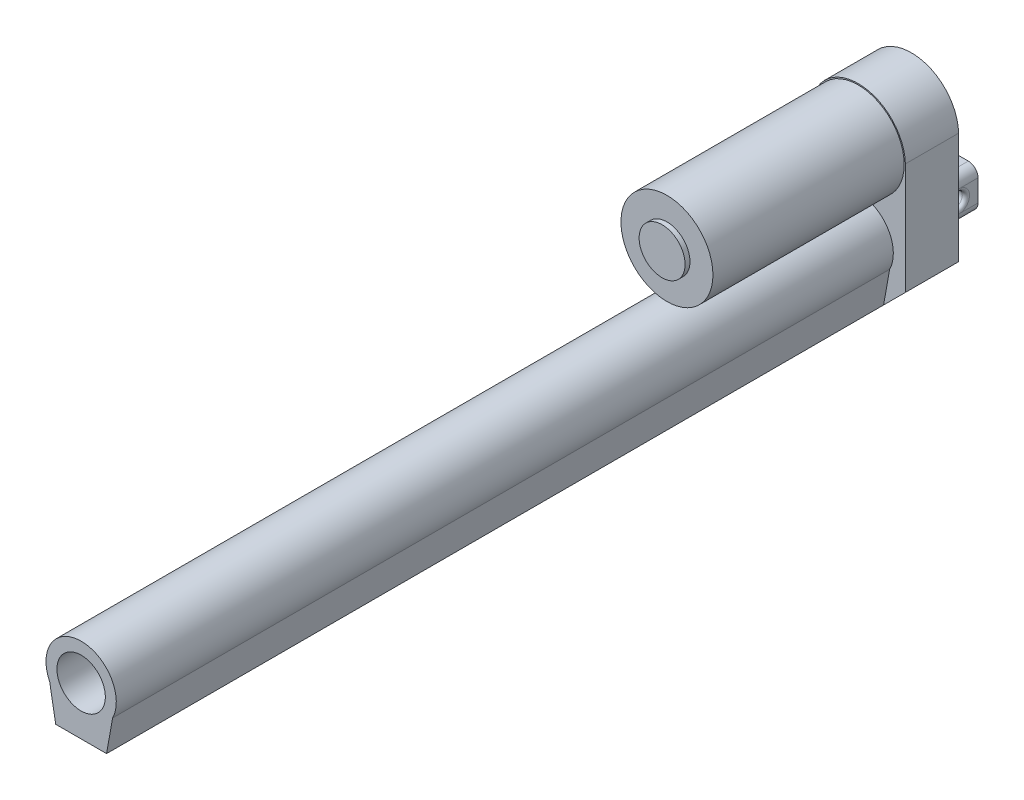
ISO-10303-21;
HEADER;
FILE_DESCRIPTION(('STEP AP214'),'2;1');
FILE_NAME('part.step','',(''),(''),'','','');
FILE_SCHEMA(('AUTOMOTIVE_DESIGN { 1 0 10303 214 1 1 1 1 }'));
ENDSEC;
DATA;
#1=APPLICATION_CONTEXT('core data for automotive mechanical design processes');
#2=APPLICATION_PROTOCOL_DEFINITION('international standard','automotive_design',2000,#1);
#3=PRODUCT_CONTEXT('',#1,'mechanical');
#4=PRODUCT('Part','Part','',(#3));
#5=PRODUCT_RELATED_PRODUCT_CATEGORY('part','',(#4));
#6=PRODUCT_DEFINITION_FORMATION('','',#4);
#7=PRODUCT_DEFINITION_CONTEXT('part definition',#1,'design');
#8=PRODUCT_DEFINITION('design','',#6,#7);
#9=PRODUCT_DEFINITION_SHAPE('','',#8);
#10=(LENGTH_UNIT() NAMED_UNIT(*) SI_UNIT(.MILLI.,.METRE.));
#11=(NAMED_UNIT(*) PLANE_ANGLE_UNIT() SI_UNIT($,.RADIAN.));
#12=(NAMED_UNIT(*) SI_UNIT($,.STERADIAN.) SOLID_ANGLE_UNIT());
#13=UNCERTAINTY_MEASURE_WITH_UNIT(LENGTH_MEASURE(1.E-05),#10,'distance_accuracy_value','');
#14=(GEOMETRIC_REPRESENTATION_CONTEXT(3) GLOBAL_UNCERTAINTY_ASSIGNED_CONTEXT((#13)) GLOBAL_UNIT_ASSIGNED_CONTEXT((#10,
#11,#12)) REPRESENTATION_CONTEXT('',''));
#15=CARTESIAN_POINT('',(0.,0.,0.));
#16=DIRECTION('',(0.,0.,1.));
#17=DIRECTION('',(1.,0.,0.));
#18=AXIS2_PLACEMENT_3D('',#15,#16,#17);
#19=CARTESIAN_POINT('',(-11.,24.,-19.));
#20=DIRECTION('',(-1.,0.,0.));
#21=DIRECTION('',(0.,-1.,0.));
#22=AXIS2_PLACEMENT_3D('',#19,#20,#21);
#23=PLANE('',#22);
#24=DIRECTION('',(0.,0.,1.));
#25=VECTOR('',#24,1.);
#26=CARTESIAN_POINT('',(-11.,24.,-19.));
#27=LINE('',#26,#25);
#28=CARTESIAN_POINT('',(-11.,24.,-19.));
#29=VERTEX_POINT('',#28);
#30=CARTESIAN_POINT('',(-11.,24.,-11.));
#31=VERTEX_POINT('',#30);
#32=EDGE_CURVE('E226',#29,#31,#27,.T.);
#33=ORIENTED_EDGE('',*,*,#32,.T.);
#34=CARTESIAN_POINT('',(-11.,19.5,-11.));
#35=DIRECTION('',(-1.,0.,0.));
#36=DIRECTION('',(0.,-1.,0.));
#37=AXIS2_PLACEMENT_3D('',#34,#35,#36);
#38=CIRCLE('',#37,4.5);
#39=CARTESIAN_POINT('',(-11.,15.,-11.));
#40=VERTEX_POINT('',#39);
#41=EDGE_CURVE('E11',#31,#40,#38,.T.);
#42=ORIENTED_EDGE('',*,*,#41,.T.);
#43=DIRECTION('',(0.,0.,1.));
#44=VECTOR('',#43,1.);
#45=CARTESIAN_POINT('',(-11.,15.,-19.));
#46=LINE('',#45,#44);
#47=CARTESIAN_POINT('',(-11.,15.,-19.));
#48=VERTEX_POINT('',#47);
#49=EDGE_CURVE('E222',#48,#40,#46,.T.);
#50=ORIENTED_EDGE('',*,*,#49,.F.);
#51=DIRECTION('',(0.,-1.,0.));
#52=VECTOR('',#51,1.);
#53=CARTESIAN_POINT('',(-11.,24.,-19.));
#54=LINE('',#53,#52);
#55=EDGE_CURVE('E196',#29,#48,#54,.T.);
#56=ORIENTED_EDGE('',*,*,#55,.F.);
#57=EDGE_LOOP('',(#33,#42,#50,#56));
#58=FACE_BOUND('',#57,.T.);
#59=ADVANCED_FACE('F32',(#58),#23,.F.);
#60=CARTESIAN_POINT('',(-28.,15.,-19.));
#61=DIRECTION('',(1.,0.,0.));
#62=DIRECTION('',(0.,1.,0.));
#63=AXIS2_PLACEMENT_3D('',#60,#61,#62);
#64=PLANE('',#63);
#65=DIRECTION('',(0.,0.,1.));
#66=VECTOR('',#65,1.);
#67=CARTESIAN_POINT('',(-28.,24.,-19.));
#68=LINE('',#67,#66);
#69=CARTESIAN_POINT('',(-28.,24.,-11.));
#70=VERTEX_POINT('',#69);
#71=CARTESIAN_POINT('',(-28.,24.,0.));
#72=VERTEX_POINT('',#71);
#73=EDGE_CURVE('E235',#70,#72,#68,.T.);
#74=ORIENTED_EDGE('',*,*,#73,.F.);
#75=CARTESIAN_POINT('',(-28.,19.5,-11.));
#76=DIRECTION('',(1.,0.,0.));
#77=DIRECTION('',(0.,1.,0.));
#78=AXIS2_PLACEMENT_3D('',#75,#76,#77);
#79=CIRCLE('',#78,4.5);
#80=CARTESIAN_POINT('',(-28.,15.,-11.));
#81=VERTEX_POINT('',#80);
#82=EDGE_CURVE('E334',#70,#81,#79,.T.);
#83=ORIENTED_EDGE('',*,*,#82,.T.);
#84=DIRECTION('',(0.,0.,1.));
#85=VECTOR('',#84,1.);
#86=CARTESIAN_POINT('',(-28.,15.,-19.));
#87=LINE('',#86,#85);
#88=CARTESIAN_POINT('',(-28.,15.,0.));
#89=VERTEX_POINT('',#88);
#90=EDGE_CURVE('E239',#81,#89,#87,.T.);
#91=ORIENTED_EDGE('',*,*,#90,.T.);
#92=DIRECTION('',(0.,1.,0.));
#93=VECTOR('',#92,1.);
#94=CARTESIAN_POINT('',(-28.,15.,0.));
#95=LINE('',#94,#93);
#96=EDGE_CURVE('E203',#89,#72,#95,.T.);
#97=ORIENTED_EDGE('',*,*,#96,.T.);
#98=EDGE_LOOP('',(#74,#83,#91,#97));
#99=FACE_BOUND('',#98,.T.);
#100=ADVANCED_FACE('F339',(#99),#64,.F.);
#101=CARTESIAN_POINT('',(-19.5,54.49375,22.));
#102=DIRECTION('',(0.,0.,1.));
#103=DIRECTION('',(1.,0.,0.));
#104=AXIS2_PLACEMENT_3D('',#101,#102,#103);
#105=PLANE('',#104);
#106=CARTESIAN_POINT('',(-19.5,54.5,22.));
#107=DIRECTION('',(0.,0.,1.));
#108=DIRECTION('',(1.,0.,0.));
#109=AXIS2_PLACEMENT_3D('',#106,#107,#108);
#110=CIRCLE('',#109,19.);
#111=CARTESIAN_POINT('',(-0.499999999999997,54.5,22.));
#112=VERTEX_POINT('',#111);
#113=EDGE_CURVE('E276',#112,#112,#110,.T.);
#114=ORIENTED_EDGE('',*,*,#113,.F.);
#115=EDGE_LOOP('',(#114));
#116=FACE_BOUND('',#115,.T.);
#117=DIRECTION('',(0.707106781186548,-0.707106781186547,0.));
#118=VECTOR('',#117,1.);
#119=CARTESIAN_POINT('',(-30.,0.,22.));
#120=LINE('',#119,#118);
#121=CARTESIAN_POINT('',(-39.,8.99999999999999,22.));
#122=VERTEX_POINT('',#121);
#123=CARTESIAN_POINT('',(-30.,0.,22.));
#124=VERTEX_POINT('',#123);
#125=EDGE_CURVE('E285',#122,#124,#120,.T.);
#126=ORIENTED_EDGE('',*,*,#125,.T.);
#127=DIRECTION('',(0.175790638483657,-0.984427575508482,0.));
#128=VECTOR('',#127,1.);
#129=CARTESIAN_POINT('',(-32.5,14.,22.));
#130=LINE('',#129,#128);
#131=CARTESIAN_POINT('',(-32.5,14.,22.));
#132=VERTEX_POINT('',#131);
#133=EDGE_CURVE('E260',#132,#124,#130,.T.);
#134=ORIENTED_EDGE('',*,*,#133,.F.);
#135=CARTESIAN_POINT('',(-19.5,20.4771637314021,22.));
#136=DIRECTION('',(0.,0.,1.));
#137=DIRECTION('',(-1.,0.,0.));
#138=AXIS2_PLACEMENT_3D('',#135,#136,#137);
#139=CIRCLE('',#138,14.5242435260288);
#140=CARTESIAN_POINT('',(-6.5,14.,22.));
#141=VERTEX_POINT('',#140);
#142=EDGE_CURVE('E246',#141,#132,#139,.T.);
#143=ORIENTED_EDGE('',*,*,#142,.F.);
#144=DIRECTION('',(0.175790638483657,0.984427575508482,0.));
#145=VECTOR('',#144,1.);
#146=CARTESIAN_POINT('',(-8.99999999999999,0.,22.));
#147=LINE('',#146,#145);
#148=CARTESIAN_POINT('',(-8.99999999999999,0.,22.));
#149=VERTEX_POINT('',#148);
#150=EDGE_CURVE('E251',#149,#141,#147,.T.);
#151=ORIENTED_EDGE('',*,*,#150,.F.);
#152=DIRECTION('',(0.707106781186548,0.707106781186547,0.));
#153=VECTOR('',#152,1.);
#154=CARTESIAN_POINT('',(-8.99999999999999,0.,22.));
#155=LINE('',#154,#153);
#156=CARTESIAN_POINT('',(0.,8.99999999999999,22.));
#157=VERTEX_POINT('',#156);
#158=EDGE_CURVE('E288',#149,#157,#155,.T.);
#159=ORIENTED_EDGE('',*,*,#158,.T.);
#160=DIRECTION('',(0.,1.,0.));
#161=VECTOR('',#160,1.);
#162=CARTESIAN_POINT('',(0.,8.99999999999999,22.));
#163=LINE('',#162,#161);
#164=CARTESIAN_POINT('',(0.,54.9875,22.));
#165=VERTEX_POINT('',#164);
#166=EDGE_CURVE('E291',#157,#165,#163,.T.);
#167=ORIENTED_EDGE('',*,*,#166,.T.);
#168=CARTESIAN_POINT('',(-19.5,54.49375,22.));
#169=DIRECTION('',(0.,0.,1.));
#170=DIRECTION('',(1.,0.,0.));
#171=AXIS2_PLACEMENT_3D('',#168,#169,#170);
#172=CIRCLE('',#171,19.50625);
#173=CARTESIAN_POINT('',(-39.,54.9875,22.));
#174=VERTEX_POINT('',#173);
#175=EDGE_CURVE('E293',#165,#174,#172,.T.);
#176=ORIENTED_EDGE('',*,*,#175,.T.);
#177=DIRECTION('',(0.,-1.,0.));
#178=VECTOR('',#177,1.);
#179=CARTESIAN_POINT('',(-39.,8.99999999999999,22.));
#180=LINE('',#179,#178);
#181=EDGE_CURVE('E295',#174,#122,#180,.T.);
#182=ORIENTED_EDGE('',*,*,#181,.T.);
#183=EDGE_LOOP('',(#126,#134,#143,#151,#159,#167,#176,#182));
#184=FACE_BOUND('',#183,.T.);
#185=ADVANCED_FACE('F388',(#116,#184),#105,.T.);
#186=CARTESIAN_POINT('',(-30.,0.,22.));
#187=DIRECTION('',(0.707106781186547,0.707106781186548,0.));
#188=DIRECTION('',(-0.707106781186548,0.707106781186547,0.));
#189=AXIS2_PLACEMENT_3D('',#186,#187,#188);
#190=PLANE('',#189);
#191=DIRECTION('',(0.707106781186548,-0.707106781186547,0.));
#192=VECTOR('',#191,1.);
#193=CARTESIAN_POINT('',(-30.,0.,0.));
#194=LINE('',#193,#192);
#195=CARTESIAN_POINT('',(-39.,8.99999999999999,0.));
#196=VERTEX_POINT('',#195);
#197=CARTESIAN_POINT('',(-30.,0.,0.));
#198=VERTEX_POINT('',#197);
#199=EDGE_CURVE('E282',#196,#198,#194,.T.);
#200=ORIENTED_EDGE('',*,*,#199,.T.);
#201=DIRECTION('',(0.,0.,-1.));
#202=VECTOR('',#201,1.);
#203=CARTESIAN_POINT('',(-30.,0.,22.));
#204=LINE('',#203,#202);
#205=EDGE_CURVE('E323',#124,#198,#204,.T.);
#206=ORIENTED_EDGE('',*,*,#205,.F.);
#207=ORIENTED_EDGE('',*,*,#125,.F.);
#208=DIRECTION('',(0.,0.,-1.));
#209=VECTOR('',#208,1.);
#210=CARTESIAN_POINT('',(-39.,8.99999999999999,22.));
#211=LINE('',#210,#209);
#212=EDGE_CURVE('E297',#122,#196,#211,.T.);
#213=ORIENTED_EDGE('',*,*,#212,.T.);
#214=EDGE_LOOP('',(#200,#206,#207,#213));
#215=FACE_BOUND('',#214,.T.);
#216=ADVANCED_FACE('F451',(#215),#190,.F.);
#217=CARTESIAN_POINT('',(-8.99999999999999,0.,22.));
#218=DIRECTION('',(0.,1.,0.));
#219=DIRECTION('',(0.,0.,1.));
#220=AXIS2_PLACEMENT_3D('',#217,#218,#219);
#221=PLANE('',#220);
#222=DIRECTION('',(1.,0.,0.));
#223=VECTOR('',#222,1.);
#224=CARTESIAN_POINT('',(-8.99999999999999,0.,0.));
#225=LINE('',#224,#223);
#226=CARTESIAN_POINT('',(-8.99999999999999,0.,0.));
#227=VERTEX_POINT('',#226);
#228=EDGE_CURVE('E300',#198,#227,#225,.T.);
#229=ORIENTED_EDGE('',*,*,#228,.T.);
#230=DIRECTION('',(0.,0.,-1.));
#231=VECTOR('',#230,1.);
#232=CARTESIAN_POINT('',(-8.99999999999999,0.,22.));
#233=LINE('',#232,#231);
#234=EDGE_CURVE('E320',#149,#227,#233,.T.);
#235=ORIENTED_EDGE('',*,*,#234,.F.);
#236=DIRECTION('',(0.,0.,-1.));
#237=VECTOR('',#236,1.);
#238=CARTESIAN_POINT('',(-8.99999999999999,0.,343.));
#239=LINE('',#238,#237);
#240=CARTESIAN_POINT('',(-8.99999999999999,0.,343.));
#241=VERTEX_POINT('',#240);
#242=EDGE_CURVE('E265',#241,#149,#239,.T.);
#243=ORIENTED_EDGE('',*,*,#242,.F.);
#244=DIRECTION('',(1.,0.,0.));
#245=VECTOR('',#244,1.);
#246=CARTESIAN_POINT('',(-30.,0.,343.));
#247=LINE('',#246,#245);
#248=CARTESIAN_POINT('',(-30.,0.,343.));
#249=VERTEX_POINT('',#248);
#250=EDGE_CURVE('E253',#249,#241,#247,.T.);
#251=ORIENTED_EDGE('',*,*,#250,.F.);
#252=DIRECTION('',(0.,0.,-1.));
#253=VECTOR('',#252,1.);
#254=CARTESIAN_POINT('',(-30.,0.,343.));
#255=LINE('',#254,#253);
#256=EDGE_CURVE('E267',#249,#124,#255,.T.);
#257=ORIENTED_EDGE('',*,*,#256,.T.);
#258=ORIENTED_EDGE('',*,*,#205,.T.);
#259=EDGE_LOOP('',(#229,#235,#243,#251,#257,#258));
#260=FACE_BOUND('',#259,.T.);
#261=ADVANCED_FACE('F470',(#260),#221,.F.);
#262=CARTESIAN_POINT('',(-8.99999999999999,0.,22.));
#263=DIRECTION('',(-0.707106781186547,0.707106781186548,0.));
#264=DIRECTION('',(-0.707106781186548,-0.707106781186547,0.));
#265=AXIS2_PLACEMENT_3D('',#262,#263,#264);
#266=PLANE('',#265);
#267=DIRECTION('',(0.707106781186548,0.707106781186547,0.));
#268=VECTOR('',#267,1.);
#269=CARTESIAN_POINT('',(-8.99999999999999,0.,0.));
#270=LINE('',#269,#268);
#271=CARTESIAN_POINT('',(0.,8.99999999999999,0.));
#272=VERTEX_POINT('',#271);
#273=EDGE_CURVE('E302',#227,#272,#270,.T.);
#274=ORIENTED_EDGE('',*,*,#273,.T.);
#275=DIRECTION('',(0.,0.,-1.));
#276=VECTOR('',#275,1.);
#277=CARTESIAN_POINT('',(0.,8.99999999999999,22.));
#278=LINE('',#277,#276);
#279=EDGE_CURVE('E317',#157,#272,#278,.T.);
#280=ORIENTED_EDGE('',*,*,#279,.F.);
#281=ORIENTED_EDGE('',*,*,#158,.F.);
#282=ORIENTED_EDGE('',*,*,#234,.T.);
#283=EDGE_LOOP('',(#274,#280,#281,#282));
#284=FACE_BOUND('',#283,.T.);
#285=ADVANCED_FACE('F466',(#284),#266,.F.);
#286=CARTESIAN_POINT('',(0.,8.99999999999999,22.));
#287=DIRECTION('',(-1.,0.,0.));
#288=DIRECTION('',(0.,0.,1.));
#289=AXIS2_PLACEMENT_3D('',#286,#287,#288);
#290=PLANE('',#289);
#291=DIRECTION('',(0.,1.,0.));
#292=VECTOR('',#291,1.);
#293=CARTESIAN_POINT('',(0.,8.99999999999999,0.));
#294=LINE('',#293,#292);
#295=CARTESIAN_POINT('',(0.,54.9875,0.));
#296=VERTEX_POINT('',#295);
#297=EDGE_CURVE('E304',#272,#296,#294,.T.);
#298=ORIENTED_EDGE('',*,*,#297,.T.);
#299=DIRECTION('',(0.,0.,-1.));
#300=VECTOR('',#299,1.);
#301=CARTESIAN_POINT('',(0.,54.9875,22.));
#302=LINE('',#301,#300);
#303=EDGE_CURVE('E314',#165,#296,#302,.T.);
#304=ORIENTED_EDGE('',*,*,#303,.F.);
#305=ORIENTED_EDGE('',*,*,#166,.F.);
#306=ORIENTED_EDGE('',*,*,#279,.T.);
#307=EDGE_LOOP('',(#298,#304,#305,#306));
#308=FACE_BOUND('',#307,.T.);
#309=ADVANCED_FACE('F462',(#308),#290,.F.);
#310=CARTESIAN_POINT('',(-19.5,54.49375,22.));
#311=DIRECTION('',(0.,0.,-1.));
#312=DIRECTION('',(-1.,0.,0.));
#313=AXIS2_PLACEMENT_3D('',#310,#311,#312);
#314=CYLINDRICAL_SURFACE('',#313,19.50625);
#315=CARTESIAN_POINT('',(-19.5,54.49375,0.));
#316=DIRECTION('',(0.,0.,1.));
#317=DIRECTION('',(1.,0.,0.));
#318=AXIS2_PLACEMENT_3D('',#315,#316,#317);
#319=CIRCLE('',#318,19.50625);
#320=CARTESIAN_POINT('',(-39.,54.9875,0.));
#321=VERTEX_POINT('',#320);
#322=EDGE_CURVE('E306',#296,#321,#319,.T.);
#323=ORIENTED_EDGE('',*,*,#322,.T.);
#324=DIRECTION('',(0.,0.,-1.));
#325=VECTOR('',#324,1.);
#326=CARTESIAN_POINT('',(-39.,54.9875,22.));
#327=LINE('',#326,#325);
#328=EDGE_CURVE('E311',#174,#321,#327,.T.);
#329=ORIENTED_EDGE('',*,*,#328,.F.);
#330=ORIENTED_EDGE('',*,*,#175,.F.);
#331=ORIENTED_EDGE('',*,*,#303,.T.);
#332=EDGE_LOOP('',(#323,#329,#330,#331));
#333=FACE_BOUND('',#332,.T.);
#334=ADVANCED_FACE('F458',(#333),#314,.T.);
#335=CARTESIAN_POINT('',(-39.,8.99999999999999,22.));
#336=DIRECTION('',(1.,0.,0.));
#337=DIRECTION('',(0.,0.,-1.));
#338=AXIS2_PLACEMENT_3D('',#335,#336,#337);
#339=PLANE('',#338);
#340=DIRECTION('',(0.,-1.,0.));
#341=VECTOR('',#340,1.);
#342=CARTESIAN_POINT('',(-39.,8.99999999999999,0.));
#343=LINE('',#342,#341);
#344=EDGE_CURVE('E289',#321,#196,#343,.T.);
#345=ORIENTED_EDGE('',*,*,#344,.T.);
#346=ORIENTED_EDGE('',*,*,#212,.F.);
#347=ORIENTED_EDGE('',*,*,#181,.F.);
#348=ORIENTED_EDGE('',*,*,#328,.T.);
#349=EDGE_LOOP('',(#345,#346,#347,#348));
#350=FACE_BOUND('',#349,.T.);
#351=ADVANCED_FACE('F455',(#350),#339,.F.);
#352=CARTESIAN_POINT('',(-19.5,54.49375,0.));
#353=DIRECTION('',(0.,0.,1.));
#354=DIRECTION('',(1.,0.,0.));
#355=AXIS2_PLACEMENT_3D('',#352,#353,#354);
#356=PLANE('',#355);
#357=DIRECTION('',(-1.,0.,0.));
#358=VECTOR('',#357,1.);
#359=CARTESIAN_POINT('',(-24.,11.,0.));
#360=LINE('',#359,#358);
#361=CARTESIAN_POINT('',(-15.,11.,0.));
#362=VERTEX_POINT('',#361);
#363=CARTESIAN_POINT('',(-24.,11.,0.));
#364=VERTEX_POINT('',#363);
#365=EDGE_CURVE('E176',#362,#364,#360,.T.);
#366=ORIENTED_EDGE('',*,*,#365,.F.);
#367=CARTESIAN_POINT('',(-15.,15.,0.));
#368=DIRECTION('',(0.,0.,-1.));
#369=DIRECTION('',(-1.,0.,0.));
#370=AXIS2_PLACEMENT_3D('',#367,#368,#369);
#371=CIRCLE('',#370,4.);
#372=CARTESIAN_POINT('',(-11.,15.,0.));
#373=VERTEX_POINT('',#372);
#374=EDGE_CURVE('E170',#373,#362,#371,.T.);
#375=ORIENTED_EDGE('',*,*,#374,.F.);
#376=DIRECTION('',(0.,-1.,0.));
#377=VECTOR('',#376,1.);
#378=CARTESIAN_POINT('',(-11.,24.,0.));
#379=LINE('',#378,#377);
#380=CARTESIAN_POINT('',(-11.,24.,0.));
#381=VERTEX_POINT('',#380);
#382=EDGE_CURVE('E215',#381,#373,#379,.T.);
#383=ORIENTED_EDGE('',*,*,#382,.F.);
#384=CARTESIAN_POINT('',(-15.,24.,0.));
#385=DIRECTION('',(0.,0.,-1.));
#386=DIRECTION('',(-1.,0.,0.));
#387=AXIS2_PLACEMENT_3D('',#384,#385,#386);
#388=CIRCLE('',#387,4.);
#389=CARTESIAN_POINT('',(-15.,28.,0.));
#390=VERTEX_POINT('',#389);
#391=EDGE_CURVE('E212',#390,#381,#388,.T.);
#392=ORIENTED_EDGE('',*,*,#391,.F.);
#393=DIRECTION('',(1.,0.,0.));
#394=VECTOR('',#393,1.);
#395=CARTESIAN_POINT('',(-24.,28.,0.));
#396=LINE('',#395,#394);
#397=CARTESIAN_POINT('',(-24.,28.,0.));
#398=VERTEX_POINT('',#397);
#399=EDGE_CURVE('E209',#398,#390,#396,.T.);
#400=ORIENTED_EDGE('',*,*,#399,.F.);
#401=CARTESIAN_POINT('',(-24.,24.,0.));
#402=DIRECTION('',(0.,0.,-1.));
#403=DIRECTION('',(-1.,0.,0.));
#404=AXIS2_PLACEMENT_3D('',#401,#402,#403);
#405=CIRCLE('',#404,4.);
#406=EDGE_CURVE('E206',#72,#398,#405,.T.);
#407=ORIENTED_EDGE('',*,*,#406,.F.);
#408=ORIENTED_EDGE('',*,*,#96,.F.);
#409=CARTESIAN_POINT('',(-24.,15.,0.));
#410=DIRECTION('',(0.,0.,-1.));
#411=DIRECTION('',(-1.,0.,0.));
#412=AXIS2_PLACEMENT_3D('',#409,#410,#411);
#413=CIRCLE('',#412,4.);
#414=EDGE_CURVE('E201',#364,#89,#413,.T.);
#415=ORIENTED_EDGE('',*,*,#414,.F.);
#416=EDGE_LOOP('',(#366,#375,#383,#392,#400,#407,#408,#415));
#417=FACE_BOUND('',#416,.T.);
#418=ORIENTED_EDGE('',*,*,#199,.F.);
#419=ORIENTED_EDGE('',*,*,#344,.F.);
#420=ORIENTED_EDGE('',*,*,#322,.F.);
#421=ORIENTED_EDGE('',*,*,#297,.F.);
#422=ORIENTED_EDGE('',*,*,#273,.F.);
#423=ORIENTED_EDGE('',*,*,#228,.F.);
#424=EDGE_LOOP('',(#418,#419,#420,#421,#422,#423));
#425=FACE_BOUND('',#424,.T.);
#426=ADVANCED_FACE('F366',(#417,#425),#356,.F.);
#427=CARTESIAN_POINT('',(-19.5,54.5,101.));
#428=DIRECTION('',(0.,0.,-1.));
#429=DIRECTION('',(-1.,0.,0.));
#430=AXIS2_PLACEMENT_3D('',#427,#428,#429);
#431=CYLINDRICAL_SURFACE('',#430,19.);
#432=CARTESIAN_POINT('',(-19.5,54.5,101.));
#433=DIRECTION('',(0.,0.,1.));
#434=DIRECTION('',(1.,0.,0.));
#435=AXIS2_PLACEMENT_3D('',#432,#433,#434);
#436=CIRCLE('',#435,19.);
#437=CARTESIAN_POINT('',(-0.499999999999997,54.5,101.));
#438=VERTEX_POINT('',#437);
#439=EDGE_CURVE('E279',#438,#438,#436,.T.);
#440=ORIENTED_EDGE('',*,*,#439,.F.);
#441=EDGE_LOOP('',(#440));
#442=FACE_BOUND('',#441,.T.);
#443=ORIENTED_EDGE('',*,*,#113,.T.);
#444=EDGE_LOOP('',(#443));
#445=FACE_BOUND('',#444,.T.);
#446=ADVANCED_FACE('F444',(#442,#445),#431,.T.);
#447=CARTESIAN_POINT('',(-19.5,54.5,101.));
#448=DIRECTION('',(0.,0.,1.));
#449=DIRECTION('',(1.,0.,0.));
#450=AXIS2_PLACEMENT_3D('',#447,#448,#449);
#451=PLANE('',#450);
#452=CARTESIAN_POINT('',(-19.5,54.5,101.));
#453=DIRECTION('',(0.,0.,1.));
#454=DIRECTION('',(1.,0.,0.));
#455=AXIS2_PLACEMENT_3D('',#452,#453,#454);
#456=CIRCLE('',#455,9.5);
#457=CARTESIAN_POINT('',(-10.,54.5,101.));
#458=VERTEX_POINT('',#457);
#459=EDGE_CURVE('E272',#458,#458,#456,.T.);
#460=ORIENTED_EDGE('',*,*,#459,.F.);
#461=EDGE_LOOP('',(#460));
#462=FACE_BOUND('',#461,.T.);
#463=ORIENTED_EDGE('',*,*,#439,.T.);
#464=EDGE_LOOP('',(#463));
#465=FACE_BOUND('',#464,.T.);
#466=ADVANCED_FACE('F440',(#462,#465),#451,.T.);
#467=CARTESIAN_POINT('',(-19.5,54.5,103.));
#468=DIRECTION('',(0.,0.,-1.));
#469=DIRECTION('',(-1.,0.,0.));
#470=AXIS2_PLACEMENT_3D('',#467,#468,#469);
#471=CYLINDRICAL_SURFACE('',#470,9.5);
#472=CARTESIAN_POINT('',(-19.5,54.5,103.));
#473=DIRECTION('',(0.,0.,1.));
#474=DIRECTION('',(1.,0.,0.));
#475=AXIS2_PLACEMENT_3D('',#472,#473,#474);
#476=CIRCLE('',#475,9.5);
#477=CARTESIAN_POINT('',(-10.,54.5,103.));
#478=VERTEX_POINT('',#477);
#479=EDGE_CURVE('E273',#478,#478,#476,.T.);
#480=ORIENTED_EDGE('',*,*,#479,.F.);
#481=EDGE_LOOP('',(#480));
#482=FACE_BOUND('',#481,.T.);
#483=ORIENTED_EDGE('',*,*,#459,.T.);
#484=EDGE_LOOP('',(#483));
#485=FACE_BOUND('',#484,.T.);
#486=ADVANCED_FACE('F436',(#482,#485),#471,.T.);
#487=CARTESIAN_POINT('',(-19.5,54.5,103.));
#488=DIRECTION('',(0.,0.,1.));
#489=DIRECTION('',(1.,0.,0.));
#490=AXIS2_PLACEMENT_3D('',#487,#488,#489);
#491=PLANE('',#490);
#492=ORIENTED_EDGE('',*,*,#479,.T.);
#493=EDGE_LOOP('',(#492));
#494=FACE_BOUND('',#493,.T.);
#495=ADVANCED_FACE('F432',(#494),#491,.T.);
#496=CARTESIAN_POINT('',(-19.5,20.4771637314021,343.));
#497=DIRECTION('',(0.,0.,-1.));
#498=DIRECTION('',(-1.,0.,0.));
#499=AXIS2_PLACEMENT_3D('',#496,#497,#498);
#500=CYLINDRICAL_SURFACE('',#499,14.5242435260288);
#501=ORIENTED_EDGE('',*,*,#142,.T.);
#502=DIRECTION('',(0.,0.,-1.));
#503=VECTOR('',#502,1.);
#504=CARTESIAN_POINT('',(-32.5,14.,343.));
#505=LINE('',#504,#503);
#506=CARTESIAN_POINT('',(-32.5,14.,343.));
#507=VERTEX_POINT('',#506);
#508=EDGE_CURVE('E270',#507,#132,#505,.T.);
#509=ORIENTED_EDGE('',*,*,#508,.F.);
#510=CARTESIAN_POINT('',(-19.5,20.4771637314021,343.));
#511=DIRECTION('',(0.,0.,1.));
#512=DIRECTION('',(-1.,0.,0.));
#513=AXIS2_PLACEMENT_3D('',#510,#511,#512);
#514=CIRCLE('',#513,14.5242435260288);
#515=CARTESIAN_POINT('',(-6.5,14.,343.));
#516=VERTEX_POINT('',#515);
#517=EDGE_CURVE('E247',#516,#507,#514,.T.);
#518=ORIENTED_EDGE('',*,*,#517,.F.);
#519=DIRECTION('',(0.,0.,-1.));
#520=VECTOR('',#519,1.);
#521=CARTESIAN_POINT('',(-6.5,14.,343.));
#522=LINE('',#521,#520);
#523=EDGE_CURVE('E257',#516,#141,#522,.T.);
#524=ORIENTED_EDGE('',*,*,#523,.T.);
#525=EDGE_LOOP('',(#501,#509,#518,#524));
#526=FACE_BOUND('',#525,.T.);
#527=ADVANCED_FACE('F428',(#526),#500,.T.);
#528=CARTESIAN_POINT('',(-32.5,14.,343.));
#529=DIRECTION('',(0.984427575508482,0.175790638483657,0.));
#530=DIRECTION('',(-0.175790638483657,0.984427575508482,0.));
#531=AXIS2_PLACEMENT_3D('',#528,#529,#530);
#532=PLANE('',#531);
#533=ORIENTED_EDGE('',*,*,#133,.T.);
#534=ORIENTED_EDGE('',*,*,#256,.F.);
#535=DIRECTION('',(0.175790638483657,-0.984427575508482,0.));
#536=VECTOR('',#535,1.);
#537=CARTESIAN_POINT('',(-32.5,14.,343.));
#538=LINE('',#537,#536);
#539=EDGE_CURVE('E250',#507,#249,#538,.T.);
#540=ORIENTED_EDGE('',*,*,#539,.F.);
#541=ORIENTED_EDGE('',*,*,#508,.T.);
#542=EDGE_LOOP('',(#533,#534,#540,#541));
#543=FACE_BOUND('',#542,.T.);
#544=ADVANCED_FACE('F424',(#543),#532,.F.);
#545=CARTESIAN_POINT('',(-8.99999999999999,0.,343.));
#546=DIRECTION('',(-0.984427575508482,0.175790638483657,0.));
#547=DIRECTION('',(-0.175790638483657,-0.984427575508482,0.));
#548=AXIS2_PLACEMENT_3D('',#545,#546,#547);
#549=PLANE('',#548);
#550=ORIENTED_EDGE('',*,*,#150,.T.);
#551=ORIENTED_EDGE('',*,*,#523,.F.);
#552=DIRECTION('',(0.175790638483657,0.984427575508482,0.));
#553=VECTOR('',#552,1.);
#554=CARTESIAN_POINT('',(-8.99999999999999,0.,343.));
#555=LINE('',#554,#553);
#556=EDGE_CURVE('E255',#241,#516,#555,.T.);
#557=ORIENTED_EDGE('',*,*,#556,.F.);
#558=ORIENTED_EDGE('',*,*,#242,.T.);
#559=EDGE_LOOP('',(#550,#551,#557,#558));
#560=FACE_BOUND('',#559,.T.);
#561=ADVANCED_FACE('F420',(#560),#549,.F.);
#562=CARTESIAN_POINT('',(-19.5,20.4771637314021,343.));
#563=DIRECTION('',(0.,0.,-1.));
#564=DIRECTION('',(-1.,0.,0.));
#565=AXIS2_PLACEMENT_3D('',#562,#563,#564);
#566=PLANE('',#565);
#567=CARTESIAN_POINT('',(-19.5,20.0014072574309,343.));
#568=DIRECTION('',(0.,0.,1.));
#569=DIRECTION('',(1.,0.,0.));
#570=AXIS2_PLACEMENT_3D('',#567,#568,#569);
#571=CIRCLE('',#570,10.);
#572=CARTESIAN_POINT('',(-9.5,20.0014072574309,343.));
#573=VERTEX_POINT('',#572);
#574=EDGE_CURVE('E179',#573,#573,#571,.T.);
#575=ORIENTED_EDGE('',*,*,#574,.F.);
#576=EDGE_LOOP('',(#575));
#577=FACE_BOUND('',#576,.T.);
#578=ORIENTED_EDGE('',*,*,#517,.T.);
#579=ORIENTED_EDGE('',*,*,#539,.T.);
#580=ORIENTED_EDGE('',*,*,#250,.T.);
#581=ORIENTED_EDGE('',*,*,#556,.T.);
#582=EDGE_LOOP('',(#578,#579,#580,#581));
#583=FACE_BOUND('',#582,.T.);
#584=ADVANCED_FACE('F416',(#577,#583),#566,.F.);
#585=CARTESIAN_POINT('',(-19.5,20.0014072574309,-6.28427124746189));
#586=DIRECTION('',(0.,0.,1.));
#587=DIRECTION('',(1.,0.,0.));
#588=AXIS2_PLACEMENT_3D('',#585,#586,#587);
#589=CYLINDRICAL_SURFACE('',#588,10.);
#590=CARTESIAN_POINT('',(-19.5,20.0014072574309,22.));
#591=DIRECTION('',(0.,0.,1.));
#592=DIRECTION('',(1.,0.,0.));
#593=AXIS2_PLACEMENT_3D('',#590,#591,#592);
#594=CIRCLE('',#593,10.);
#595=CARTESIAN_POINT('',(-9.5,20.0014072574309,22.));
#596=VERTEX_POINT('',#595);
#597=EDGE_CURVE('E243',#596,#596,#594,.F.);
#598=ORIENTED_EDGE('',*,*,#597,.T.);
#599=EDGE_LOOP('',(#598));
#600=FACE_BOUND('',#599,.T.);
#601=ORIENTED_EDGE('',*,*,#574,.T.);
#602=EDGE_LOOP('',(#601));
#603=FACE_BOUND('',#602,.T.);
#604=ADVANCED_FACE('F412',(#600,#603),#589,.F.);
#605=CARTESIAN_POINT('',(-19.5,54.49375,22.));
#606=DIRECTION('',(0.,0.,1.));
#607=DIRECTION('',(1.,0.,0.));
#608=AXIS2_PLACEMENT_3D('',#605,#606,#607);
#609=PLANE('',#608);
#610=ORIENTED_EDGE('',*,*,#597,.F.);
#611=EDGE_LOOP('',(#610));
#612=FACE_BOUND('',#611,.T.);
#613=ADVANCED_FACE('F409',(#612),#609,.T.);
#614=CARTESIAN_POINT('',(-24.,11.,-19.));
#615=DIRECTION('',(0.,1.,0.));
#616=DIRECTION('',(0.,0.,1.));
#617=AXIS2_PLACEMENT_3D('',#614,#615,#616);
#618=PLANE('',#617);
#619=ORIENTED_EDGE('',*,*,#365,.T.);
#620=DIRECTION('',(0.,0.,1.));
#621=VECTOR('',#620,1.);
#622=CARTESIAN_POINT('',(-24.,11.,-19.));
#623=LINE('',#622,#621);
#624=CARTESIAN_POINT('',(-24.,11.,-19.));
#625=VERTEX_POINT('',#624);
#626=EDGE_CURVE('E174',#625,#364,#623,.T.);
#627=ORIENTED_EDGE('',*,*,#626,.F.);
#628=DIRECTION('',(-1.,0.,0.));
#629=VECTOR('',#628,1.);
#630=CARTESIAN_POINT('',(-15.,11.,-19.));
#631=LINE('',#630,#629);
#632=CARTESIAN_POINT('',(-15.,11.,-19.));
#633=VERTEX_POINT('',#632);
#634=EDGE_CURVE('E159',#633,#625,#631,.T.);
#635=ORIENTED_EDGE('',*,*,#634,.F.);
#636=DIRECTION('',(0.,0.,1.));
#637=VECTOR('',#636,1.);
#638=CARTESIAN_POINT('',(-15.,11.,-19.));
#639=LINE('',#638,#637);
#640=EDGE_CURVE('E199',#633,#362,#639,.T.);
#641=ORIENTED_EDGE('',*,*,#640,.T.);
#642=EDGE_LOOP('',(#619,#627,#635,#641));
#643=FACE_BOUND('',#642,.T.);
#644=ADVANCED_FACE('F175',(#643),#618,.F.);
#645=CARTESIAN_POINT('',(-24.,15.,-19.));
#646=DIRECTION('',(0.,0.,1.));
#647=DIRECTION('',(1.,0.,0.));
#648=AXIS2_PLACEMENT_3D('',#645,#646,#647);
#649=CYLINDRICAL_SURFACE('',#648,4.);
#650=ORIENTED_EDGE('',*,*,#414,.T.);
#651=ORIENTED_EDGE('',*,*,#90,.F.);
#652=CARTESIAN_POINT('',(-28.,15.,-19.));
#653=VERTEX_POINT('',#652);
#654=EDGE_CURVE('E180',#653,#81,#87,.T.);
#655=ORIENTED_EDGE('',*,*,#654,.F.);
#656=CARTESIAN_POINT('',(-24.,15.,-19.));
#657=DIRECTION('',(0.,0.,-1.));
#658=DIRECTION('',(-1.,0.,0.));
#659=AXIS2_PLACEMENT_3D('',#656,#657,#658);
#660=CIRCLE('',#659,4.);
#661=EDGE_CURVE('E163',#625,#653,#660,.T.);
#662=ORIENTED_EDGE('',*,*,#661,.F.);
#663=ORIENTED_EDGE('',*,*,#626,.T.);
#664=EDGE_LOOP('',(#650,#651,#655,#662,#663));
#665=FACE_BOUND('',#664,.T.);
#666=ADVANCED_FACE('F182',(#665),#649,.T.);
#667=ORIENTED_EDGE('',*,*,#654,.T.);
#668=CARTESIAN_POINT('',(-28.,19.5,-11.));
#669=DIRECTION('',(1.,0.,0.));
#670=DIRECTION('',(0.,1.,0.));
#671=AXIS2_PLACEMENT_3D('',#668,#669,#670);
#672=CIRCLE('',#671,4.5);
#673=EDGE_CURVE('E332',#81,#70,#672,.T.);
#674=ORIENTED_EDGE('',*,*,#673,.T.);
#675=CARTESIAN_POINT('',(-28.,24.,-19.));
#676=VERTEX_POINT('',#675);
#677=EDGE_CURVE('E236',#676,#70,#68,.T.);
#678=ORIENTED_EDGE('',*,*,#677,.F.);
#679=DIRECTION('',(0.,1.,0.));
#680=VECTOR('',#679,1.);
#681=CARTESIAN_POINT('',(-28.,15.,-19.));
#682=LINE('',#681,#680);
#683=EDGE_CURVE('E186',#653,#676,#682,.T.);
#684=ORIENTED_EDGE('',*,*,#683,.F.);
#685=EDGE_LOOP('',(#667,#674,#678,#684));
#686=FACE_BOUND('',#685,.T.);
#687=ADVANCED_FACE('F343',(#686),#64,.F.);
#688=CARTESIAN_POINT('',(-24.,24.,-19.));
#689=DIRECTION('',(0.,0.,1.));
#690=DIRECTION('',(1.,0.,0.));
#691=AXIS2_PLACEMENT_3D('',#688,#689,#690);
#692=CYLINDRICAL_SURFACE('',#691,4.);
#693=ORIENTED_EDGE('',*,*,#406,.T.);
#694=DIRECTION('',(0.,0.,1.));
#695=VECTOR('',#694,1.);
#696=CARTESIAN_POINT('',(-24.,28.,-19.));
#697=LINE('',#696,#695);
#698=CARTESIAN_POINT('',(-24.,28.,-19.));
#699=VERTEX_POINT('',#698);
#700=EDGE_CURVE('E232',#699,#398,#697,.T.);
#701=ORIENTED_EDGE('',*,*,#700,.F.);
#702=CARTESIAN_POINT('',(-24.,24.,-19.));
#703=DIRECTION('',(0.,0.,-1.));
#704=DIRECTION('',(-1.,0.,0.));
#705=AXIS2_PLACEMENT_3D('',#702,#703,#704);
#706=CIRCLE('',#705,4.);
#707=EDGE_CURVE('E188',#676,#699,#706,.T.);
#708=ORIENTED_EDGE('',*,*,#707,.F.);
#709=ORIENTED_EDGE('',*,*,#677,.T.);
#710=ORIENTED_EDGE('',*,*,#73,.T.);
#711=EDGE_LOOP('',(#693,#701,#708,#709,#710));
#712=FACE_BOUND('',#711,.T.);
#713=ADVANCED_FACE('F350',(#712),#692,.T.);
#714=CARTESIAN_POINT('',(-24.,28.,-19.));
#715=DIRECTION('',(0.,-1.,0.));
#716=DIRECTION('',(1.,0.,0.));
#717=AXIS2_PLACEMENT_3D('',#714,#715,#716);
#718=PLANE('',#717);
#719=ORIENTED_EDGE('',*,*,#399,.T.);
#720=DIRECTION('',(0.,0.,1.));
#721=VECTOR('',#720,1.);
#722=CARTESIAN_POINT('',(-15.,28.,-19.));
#723=LINE('',#722,#721);
#724=CARTESIAN_POINT('',(-15.,28.,-19.));
#725=VERTEX_POINT('',#724);
#726=EDGE_CURVE('E229',#725,#390,#723,.T.);
#727=ORIENTED_EDGE('',*,*,#726,.F.);
#728=DIRECTION('',(1.,0.,0.));
#729=VECTOR('',#728,1.);
#730=CARTESIAN_POINT('',(-24.,28.,-19.));
#731=LINE('',#730,#729);
#732=EDGE_CURVE('E192',#699,#725,#731,.T.);
#733=ORIENTED_EDGE('',*,*,#732,.F.);
#734=ORIENTED_EDGE('',*,*,#700,.T.);
#735=EDGE_LOOP('',(#719,#727,#733,#734));
#736=FACE_BOUND('',#735,.T.);
#737=ADVANCED_FACE('F353',(#736),#718,.F.);
#738=CARTESIAN_POINT('',(-15.,24.,-19.));
#739=DIRECTION('',(0.,0.,1.));
#740=DIRECTION('',(1.,0.,0.));
#741=AXIS2_PLACEMENT_3D('',#738,#739,#740);
#742=CYLINDRICAL_SURFACE('',#741,4.);
#743=ORIENTED_EDGE('',*,*,#391,.T.);
#744=EDGE_CURVE('E225',#31,#381,#27,.T.);
#745=ORIENTED_EDGE('',*,*,#744,.F.);
#746=ORIENTED_EDGE('',*,*,#32,.F.);
#747=CARTESIAN_POINT('',(-15.,24.,-19.));
#748=DIRECTION('',(0.,0.,-1.));
#749=DIRECTION('',(-1.,0.,0.));
#750=AXIS2_PLACEMENT_3D('',#747,#748,#749);
#751=CIRCLE('',#750,4.);
#752=EDGE_CURVE('E194',#725,#29,#751,.T.);
#753=ORIENTED_EDGE('',*,*,#752,.F.);
#754=ORIENTED_EDGE('',*,*,#726,.T.);
#755=EDGE_LOOP('',(#743,#745,#746,#753,#754));
#756=FACE_BOUND('',#755,.T.);
#757=ADVANCED_FACE('F357',(#756),#742,.T.);
#758=EDGE_CURVE('E221',#40,#373,#46,.T.);
#759=ORIENTED_EDGE('',*,*,#758,.F.);
#760=CARTESIAN_POINT('',(-11.,19.5,-11.));
#761=DIRECTION('',(-1.,0.,0.));
#762=DIRECTION('',(0.,-1.,0.));
#763=AXIS2_PLACEMENT_3D('',#760,#761,#762);
#764=CIRCLE('',#763,4.5);
#765=EDGE_CURVE('E40',#40,#31,#764,.T.);
#766=ORIENTED_EDGE('',*,*,#765,.T.);
#767=ORIENTED_EDGE('',*,*,#744,.T.);
#768=ORIENTED_EDGE('',*,*,#382,.T.);
#769=EDGE_LOOP('',(#759,#766,#767,#768));
#770=FACE_BOUND('',#769,.T.);
#771=ADVANCED_FACE('F368',(#770),#23,.F.);
#772=CARTESIAN_POINT('',(-15.,15.,-19.));
#773=DIRECTION('',(0.,0.,1.));
#774=DIRECTION('',(1.,0.,0.));
#775=AXIS2_PLACEMENT_3D('',#772,#773,#774);
#776=CYLINDRICAL_SURFACE('',#775,4.);
#777=ORIENTED_EDGE('',*,*,#374,.T.);
#778=ORIENTED_EDGE('',*,*,#640,.F.);
#779=CARTESIAN_POINT('',(-15.,15.,-19.));
#780=DIRECTION('',(0.,0.,-1.));
#781=DIRECTION('',(-1.,0.,0.));
#782=AXIS2_PLACEMENT_3D('',#779,#780,#781);
#783=CIRCLE('',#782,4.);
#784=EDGE_CURVE('E166',#48,#633,#783,.T.);
#785=ORIENTED_EDGE('',*,*,#784,.F.);
#786=ORIENTED_EDGE('',*,*,#49,.T.);
#787=ORIENTED_EDGE('',*,*,#758,.T.);
#788=EDGE_LOOP('',(#777,#778,#785,#786,#787));
#789=FACE_BOUND('',#788,.T.);
#790=ADVANCED_FACE('F362',(#789),#776,.T.);
#791=CARTESIAN_POINT('',(-24.,15.,-19.));
#792=DIRECTION('',(0.,0.,-1.));
#793=DIRECTION('',(-1.,0.,0.));
#794=AXIS2_PLACEMENT_3D('',#791,#792,#793);
#795=PLANE('',#794);
#796=ORIENTED_EDGE('',*,*,#634,.T.);
#797=ORIENTED_EDGE('',*,*,#661,.T.);
#798=ORIENTED_EDGE('',*,*,#683,.T.);
#799=ORIENTED_EDGE('',*,*,#707,.T.);
#800=ORIENTED_EDGE('',*,*,#732,.T.);
#801=ORIENTED_EDGE('',*,*,#752,.T.);
#802=ORIENTED_EDGE('',*,*,#55,.T.);
#803=ORIENTED_EDGE('',*,*,#784,.T.);
#804=EDGE_LOOP('',(#796,#797,#798,#799,#800,#801,#802,#803));
#805=FACE_BOUND('',#804,.T.);
#806=ADVANCED_FACE('F161',(#805),#795,.T.);
#807=CARTESIAN_POINT('',(-39.001,19.5,-11.));
#808=DIRECTION('',(1.,0.,0.));
#809=DIRECTION('',(0.,1.,0.));
#810=AXIS2_PLACEMENT_3D('',#807,#808,#809);
#811=CYLINDRICAL_SURFACE('',#810,3.);
#812=CARTESIAN_POINT('',(-26.5,19.5,-11.));
#813=DIRECTION('',(1.,0.,0.));
#814=DIRECTION('',(0.,1.,0.));
#815=AXIS2_PLACEMENT_3D('',#812,#813,#814);
#816=CIRCLE('',#815,3.);
#817=CARTESIAN_POINT('',(-26.5,22.5,-11.));
#818=VERTEX_POINT('',#817);
#819=EDGE_CURVE('E329',#818,#818,#816,.F.);
#820=ORIENTED_EDGE('',*,*,#819,.T.);
#821=EDGE_LOOP('',(#820));
#822=FACE_BOUND('',#821,.T.);
#823=CARTESIAN_POINT('',(-12.5,19.5,-11.));
#824=DIRECTION('',(-1.,0.,0.));
#825=DIRECTION('',(0.,-1.,0.));
#826=AXIS2_PLACEMENT_3D('',#823,#824,#825);
#827=CIRCLE('',#826,3.);
#828=CARTESIAN_POINT('',(-12.5,16.5,-11.));
#829=VERTEX_POINT('',#828);
#830=EDGE_CURVE('E326',#829,#829,#827,.F.);
#831=ORIENTED_EDGE('',*,*,#830,.T.);
#832=EDGE_LOOP('',(#831));
#833=FACE_BOUND('',#832,.T.);
#834=ADVANCED_FACE('F374',(#822,#833),#811,.F.);
#835=CARTESIAN_POINT('',(-26.5,19.5,-11.));
#836=DIRECTION('',(1.,0.,0.));
#837=DIRECTION('',(0.,1.,0.));
#838=AXIS2_PLACEMENT_3D('',#835,#836,#837);
#839=TOROIDAL_SURFACE('',#838,4.5,1.5);
#840=ORIENTED_EDGE('',*,*,#673,.F.);
#841=ORIENTED_EDGE('',*,*,#82,.F.);
#842=EDGE_LOOP('',(#840,#841));
#843=FACE_BOUND('',#842,.T.);
#844=ORIENTED_EDGE('',*,*,#819,.F.);
#845=EDGE_LOOP('',(#844));
#846=FACE_BOUND('',#845,.T.);
#847=ADVANCED_FACE('F371',(#843,#846),#839,.T.);
#848=CARTESIAN_POINT('',(-12.5,19.5,-11.));
#849=DIRECTION('',(-1.,0.,0.));
#850=DIRECTION('',(0.,-1.,0.));
#851=AXIS2_PLACEMENT_3D('',#848,#849,#850);
#852=TOROIDAL_SURFACE('',#851,4.5,1.5);
#853=ORIENTED_EDGE('',*,*,#765,.F.);
#854=ORIENTED_EDGE('',*,*,#41,.F.);
#855=EDGE_LOOP('',(#853,#854));
#856=FACE_BOUND('',#855,.T.);
#857=ORIENTED_EDGE('',*,*,#830,.F.);
#858=EDGE_LOOP('',(#857));
#859=FACE_BOUND('',#858,.T.);
#860=ADVANCED_FACE('F34',(#856,#859),#852,.T.);
#861=CLOSED_SHELL('',(#59,#100,#185,#216,#261,#285,#309,#334,#351,#426,#446,#466,#486,#495,#527,
#544,#561,#584,#604,#613,#644,#666,#687,#713,#737,#757,#771,#790,#806,#834,#847,#860));
#862=MANIFOLD_SOLID_BREP('B2',#861);
#863=ADVANCED_BREP_SHAPE_REPRESENTATION('',(#18,#862),#14);
#864=SHAPE_DEFINITION_REPRESENTATION(#9,#863);
ENDSEC;
END-ISO-10303-21;
